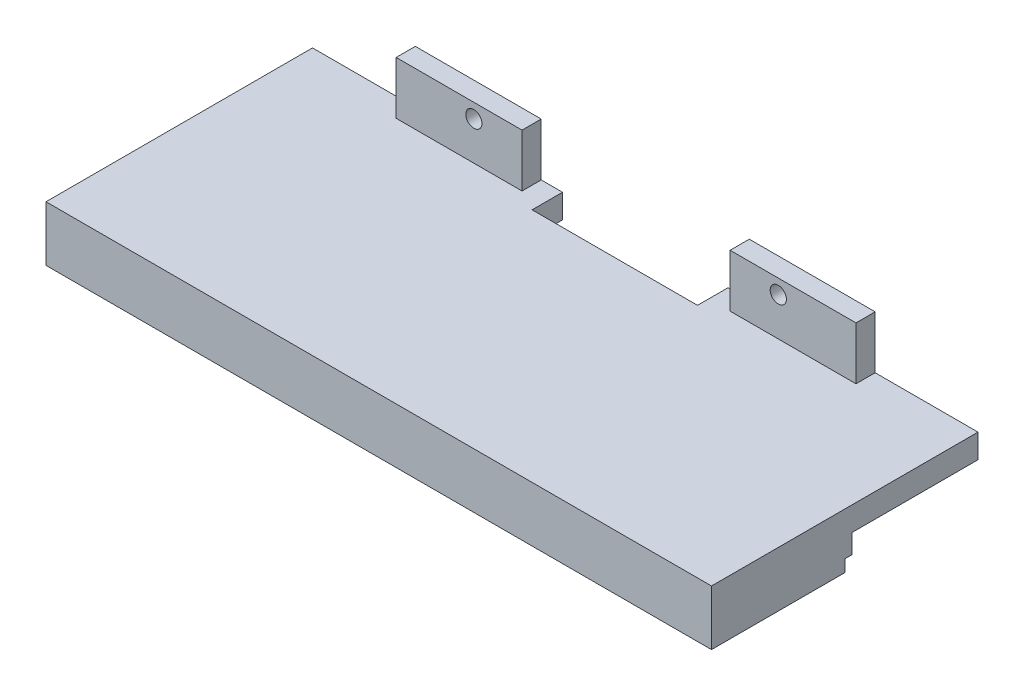
ISO-10303-21;
HEADER;
FILE_DESCRIPTION(('STEP AP214'),'2;1');
FILE_NAME('part.step','',(''),(''),'','','');
FILE_SCHEMA(('AUTOMOTIVE_DESIGN { 1 0 10303 214 1 1 1 1 }'));
ENDSEC;
DATA;
#1=APPLICATION_CONTEXT('core data for automotive mechanical design processes');
#2=APPLICATION_PROTOCOL_DEFINITION('international standard','automotive_design',2000,#1);
#3=PRODUCT_CONTEXT('',#1,'mechanical');
#4=PRODUCT('Part','Part','',(#3));
#5=PRODUCT_RELATED_PRODUCT_CATEGORY('part','',(#4));
#6=PRODUCT_DEFINITION_FORMATION('','',#4);
#7=PRODUCT_DEFINITION_CONTEXT('part definition',#1,'design');
#8=PRODUCT_DEFINITION('design','',#6,#7);
#9=PRODUCT_DEFINITION_SHAPE('','',#8);
#10=(LENGTH_UNIT() NAMED_UNIT(*) SI_UNIT(.MILLI.,.METRE.));
#11=(NAMED_UNIT(*) PLANE_ANGLE_UNIT() SI_UNIT($,.RADIAN.));
#12=(NAMED_UNIT(*) SI_UNIT($,.STERADIAN.) SOLID_ANGLE_UNIT());
#13=UNCERTAINTY_MEASURE_WITH_UNIT(LENGTH_MEASURE(1.E-05),#10,'distance_accuracy_value','');
#14=(GEOMETRIC_REPRESENTATION_CONTEXT(3) GLOBAL_UNCERTAINTY_ASSIGNED_CONTEXT((#13)) GLOBAL_UNIT_ASSIGNED_CONTEXT((#10,
#11,#12)) REPRESENTATION_CONTEXT('',''));
#15=CARTESIAN_POINT('',(0.,0.,0.));
#16=DIRECTION('',(0.,0.,1.));
#17=DIRECTION('',(1.,0.,0.));
#18=AXIS2_PLACEMENT_3D('',#15,#16,#17);
#19=CARTESIAN_POINT('',(0.,0.,55.66875));
#20=DIRECTION('',(0.,1.,0.));
#21=DIRECTION('',(-1.,0.,0.));
#22=AXIS2_PLACEMENT_3D('',#19,#20,#21);
#23=PLANE('',#22);
#24=DIRECTION('',(0.,0.,-1.));
#25=VECTOR('',#24,1.);
#26=CARTESIAN_POINT('',(-234.7,0.,0.));
#27=LINE('',#26,#25);
#28=CARTESIAN_POINT('',(-234.7,0.,-47.5));
#29=VERTEX_POINT('',#28);
#30=CARTESIAN_POINT('',(-234.7,0.,-55.5));
#31=VERTEX_POINT('',#30);
#32=EDGE_CURVE('E222',#29,#31,#27,.T.);
#33=ORIENTED_EDGE('',*,*,#32,.T.);
#34=DIRECTION('',(1.,0.,0.));
#35=VECTOR('',#34,1.);
#36=CARTESIAN_POINT('',(0.,0.,-55.5));
#37=LINE('',#36,#35);
#38=CARTESIAN_POINT('',(-277.6,0.,-55.5));
#39=VERTEX_POINT('',#38);
#40=EDGE_CURVE('E328',#39,#31,#37,.T.);
#41=ORIENTED_EDGE('',*,*,#40,.F.);
#42=DIRECTION('',(0.,0.,-1.));
#43=VECTOR('',#42,1.);
#44=CARTESIAN_POINT('',(-277.6,0.,55.66875));
#45=LINE('',#44,#43);
#46=CARTESIAN_POINT('',(-277.6,0.,55.66875));
#47=VERTEX_POINT('',#46);
#48=EDGE_CURVE('E48',#47,#39,#45,.T.);
#49=ORIENTED_EDGE('',*,*,#48,.F.);
#50=DIRECTION('',(1.,0.,0.));
#51=VECTOR('',#50,1.);
#52=CARTESIAN_POINT('',(0.,0.,55.66875));
#53=LINE('',#52,#51);
#54=CARTESIAN_POINT('',(0.,0.,55.66875));
#55=VERTEX_POINT('',#54);
#56=EDGE_CURVE('E374',#47,#55,#53,.T.);
#57=ORIENTED_EDGE('',*,*,#56,.T.);
#58=DIRECTION('',(0.,0.,-1.));
#59=VECTOR('',#58,1.);
#60=CARTESIAN_POINT('',(0.,0.,55.66875));
#61=LINE('',#60,#59);
#62=CARTESIAN_POINT('',(0.,0.,-55.5));
#63=VERTEX_POINT('',#62);
#64=EDGE_CURVE('E382',#55,#63,#61,.T.);
#65=ORIENTED_EDGE('',*,*,#64,.T.);
#66=DIRECTION('',(1.,0.,0.));
#67=VECTOR('',#66,1.);
#68=CARTESIAN_POINT('',(0.,0.,-55.5));
#69=LINE('',#68,#67);
#70=CARTESIAN_POINT('',(-42.9,0.,-55.5));
#71=VERTEX_POINT('',#70);
#72=EDGE_CURVE('E318',#71,#63,#69,.T.);
#73=ORIENTED_EDGE('',*,*,#72,.F.);
#74=DIRECTION('',(0.,0.,-1.));
#75=VECTOR('',#74,1.);
#76=CARTESIAN_POINT('',(-42.9,0.,0.));
#77=LINE('',#76,#75);
#78=CARTESIAN_POINT('',(-42.9,0.,-47.5));
#79=VERTEX_POINT('',#78);
#80=EDGE_CURVE('E258',#79,#71,#77,.T.);
#81=ORIENTED_EDGE('',*,*,#80,.F.);
#82=DIRECTION('',(1.,0.,0.));
#83=VECTOR('',#82,1.);
#84=CARTESIAN_POINT('',(0.,0.,-47.5));
#85=LINE('',#84,#83);
#86=CARTESIAN_POINT('',(-95.4,0.,-47.5));
#87=VERTEX_POINT('',#86);
#88=EDGE_CURVE('E69',#87,#79,#85,.T.);
#89=ORIENTED_EDGE('',*,*,#88,.F.);
#90=DIRECTION('',(0.,0.,-1.));
#91=VECTOR('',#90,1.);
#92=CARTESIAN_POINT('',(-95.4,0.,0.));
#93=LINE('',#92,#91);
#94=CARTESIAN_POINT('',(-95.4,0.,-55.5));
#95=VERTEX_POINT('',#94);
#96=EDGE_CURVE('E225',#87,#95,#93,.T.);
#97=ORIENTED_EDGE('',*,*,#96,.T.);
#98=CARTESIAN_POINT('',(-104.3,0.,-55.5));
#99=VERTEX_POINT('',#98);
#100=EDGE_CURVE('E322',#99,#95,#69,.T.);
#101=ORIENTED_EDGE('',*,*,#100,.F.);
#102=DIRECTION('',(0.,0.,1.));
#103=VECTOR('',#102,1.);
#104=CARTESIAN_POINT('',(-104.3,0.,0.));
#105=LINE('',#104,#103);
#106=CARTESIAN_POINT('',(-104.3,0.,-42.8));
#107=VERTEX_POINT('',#106);
#108=EDGE_CURVE('E298',#99,#107,#105,.T.);
#109=ORIENTED_EDGE('',*,*,#108,.T.);
#110=DIRECTION('',(-1.,0.,0.));
#111=VECTOR('',#110,1.);
#112=CARTESIAN_POINT('',(2.41031027664994E-13,0.,-42.7999999999994));
#113=LINE('',#112,#111);
#114=CARTESIAN_POINT('',(-173.3,0.,-42.8000000000004));
#115=VERTEX_POINT('',#114);
#116=EDGE_CURVE('E301',#107,#115,#113,.T.);
#117=ORIENTED_EDGE('',*,*,#116,.T.);
#118=DIRECTION('',(0.,0.,-1.));
#119=VECTOR('',#118,1.);
#120=CARTESIAN_POINT('',(-173.3,0.,0.));
#121=LINE('',#120,#119);
#122=CARTESIAN_POINT('',(-173.3,0.,-55.5));
#123=VERTEX_POINT('',#122);
#124=EDGE_CURVE('E284',#115,#123,#121,.T.);
#125=ORIENTED_EDGE('',*,*,#124,.T.);
#126=CARTESIAN_POINT('',(-182.2,0.,-55.5));
#127=VERTEX_POINT('',#126);
#128=EDGE_CURVE('E321',#127,#123,#37,.T.);
#129=ORIENTED_EDGE('',*,*,#128,.F.);
#130=DIRECTION('',(0.,0.,-1.));
#131=VECTOR('',#130,1.);
#132=CARTESIAN_POINT('',(-182.2,0.,0.));
#133=LINE('',#132,#131);
#134=CARTESIAN_POINT('',(-182.2,0.,-47.5));
#135=VERTEX_POINT('',#134);
#136=EDGE_CURVE('E61',#135,#127,#133,.T.);
#137=ORIENTED_EDGE('',*,*,#136,.F.);
#138=DIRECTION('',(1.,0.,0.));
#139=VECTOR('',#138,1.);
#140=CARTESIAN_POINT('',(0.,0.,-47.5));
#141=LINE('',#140,#139);
#142=EDGE_CURVE('E239',#29,#135,#141,.T.);
#143=ORIENTED_EDGE('',*,*,#142,.F.);
#144=EDGE_LOOP('',(#33,#41,#49,#57,#65,#73,#81,#89,#97,#101,#109,#117,#125,#129,#137,#143));
#145=FACE_BOUND('',#144,.T.);
#146=ADVANCED_FACE('F45',(#145),#23,.T.);
#147=CARTESIAN_POINT('',(0.,0.,-3.));
#148=DIRECTION('',(0.,0.,1.));
#149=DIRECTION('',(1.,0.,0.));
#150=AXIS2_PLACEMENT_3D('',#147,#148,#149);
#151=PLANE('',#150);
#152=DIRECTION('',(-1.,0.,0.));
#153=VECTOR('',#152,1.);
#154=CARTESIAN_POINT('',(0.,-10.,-3.));
#155=LINE('',#154,#153);
#156=CARTESIAN_POINT('',(0.,-10.,-3.));
#157=VERTEX_POINT('',#156);
#158=CARTESIAN_POINT('',(-277.6,-10.,-3.));
#159=VERTEX_POINT('',#158);
#160=EDGE_CURVE('E327',#157,#159,#155,.T.);
#161=ORIENTED_EDGE('',*,*,#160,.F.);
#162=DIRECTION('',(0.,1.,0.));
#163=VECTOR('',#162,1.);
#164=CARTESIAN_POINT('',(0.,0.,-3.));
#165=LINE('',#164,#163);
#166=CARTESIAN_POINT('',(0.,-18.,-3.));
#167=VERTEX_POINT('',#166);
#168=EDGE_CURVE('E350',#167,#157,#165,.T.);
#169=ORIENTED_EDGE('',*,*,#168,.F.);
#170=DIRECTION('',(-1.,0.,0.));
#171=VECTOR('',#170,1.);
#172=CARTESIAN_POINT('',(0.,-18.,-3.));
#173=LINE('',#172,#171);
#174=CARTESIAN_POINT('',(-277.6,-18.,-3.));
#175=VERTEX_POINT('',#174);
#176=EDGE_CURVE('E347',#167,#175,#173,.T.);
#177=ORIENTED_EDGE('',*,*,#176,.T.);
#178=DIRECTION('',(0.,1.,0.));
#179=VECTOR('',#178,1.);
#180=CARTESIAN_POINT('',(-277.6,0.,-3.));
#181=LINE('',#180,#179);
#182=EDGE_CURVE('E344',#175,#159,#181,.T.);
#183=ORIENTED_EDGE('',*,*,#182,.T.);
#184=EDGE_LOOP('',(#161,#169,#177,#183));
#185=FACE_BOUND('',#184,.T.);
#186=ADVANCED_FACE('F419',(#185),#151,.F.);
#187=CARTESIAN_POINT('',(0.,0.,0.));
#188=DIRECTION('',(0.,0.,1.));
#189=DIRECTION('',(1.,0.,0.));
#190=AXIS2_PLACEMENT_3D('',#187,#188,#189);
#191=PLANE('',#190);
#192=DIRECTION('',(0.,1.,0.));
#193=VECTOR('',#192,1.);
#194=CARTESIAN_POINT('',(0.,0.,0.));
#195=LINE('',#194,#193);
#196=CARTESIAN_POINT('',(0.,-23.,0.));
#197=VERTEX_POINT('',#196);
#198=CARTESIAN_POINT('',(0.,-18.,0.));
#199=VERTEX_POINT('',#198);
#200=EDGE_CURVE('E384',#197,#199,#195,.T.);
#201=ORIENTED_EDGE('',*,*,#200,.F.);
#202=DIRECTION('',(-1.,0.,0.));
#203=VECTOR('',#202,1.);
#204=CARTESIAN_POINT('',(0.,-23.,0.));
#205=LINE('',#204,#203);
#206=CARTESIAN_POINT('',(-5.00000000000001,-23.,0.));
#207=VERTEX_POINT('',#206);
#208=EDGE_CURVE('E336',#197,#207,#205,.T.);
#209=ORIENTED_EDGE('',*,*,#208,.T.);
#210=DIRECTION('',(0.,1.,0.));
#211=VECTOR('',#210,1.);
#212=CARTESIAN_POINT('',(-5.00000000000001,0.,0.));
#213=LINE('',#212,#211);
#214=CARTESIAN_POINT('',(-5.00000000000001,-18.,0.));
#215=VERTEX_POINT('',#214);
#216=EDGE_CURVE('E378',#207,#215,#213,.T.);
#217=ORIENTED_EDGE('',*,*,#216,.T.);
#218=DIRECTION('',(-1.,0.,0.));
#219=VECTOR('',#218,1.);
#220=CARTESIAN_POINT('',(0.,-18.,0.));
#221=LINE('',#220,#219);
#222=EDGE_CURVE('E348',#199,#215,#221,.T.);
#223=ORIENTED_EDGE('',*,*,#222,.F.);
#224=EDGE_LOOP('',(#201,#209,#217,#223));
#225=FACE_BOUND('',#224,.T.);
#226=ADVANCED_FACE('F492',(#225),#191,.F.);
#227=DIRECTION('',(0.,-1.,0.));
#228=VECTOR('',#227,1.);
#229=CARTESIAN_POINT('',(-272.6,0.,0.));
#230=LINE('',#229,#228);
#231=CARTESIAN_POINT('',(-272.6,-18.,0.));
#232=VERTEX_POINT('',#231);
#233=CARTESIAN_POINT('',(-272.6,-23.,0.));
#234=VERTEX_POINT('',#233);
#235=EDGE_CURVE('E386',#232,#234,#230,.T.);
#236=ORIENTED_EDGE('',*,*,#235,.T.);
#237=CARTESIAN_POINT('',(-277.6,-23.,0.));
#238=VERTEX_POINT('',#237);
#239=EDGE_CURVE('E340',#234,#238,#205,.T.);
#240=ORIENTED_EDGE('',*,*,#239,.T.);
#241=DIRECTION('',(0.,1.,0.));
#242=VECTOR('',#241,1.);
#243=CARTESIAN_POINT('',(-277.6,0.,0.));
#244=LINE('',#243,#242);
#245=CARTESIAN_POINT('',(-277.6,-18.,0.));
#246=VERTEX_POINT('',#245);
#247=EDGE_CURVE('E373',#238,#246,#244,.T.);
#248=ORIENTED_EDGE('',*,*,#247,.T.);
#249=EDGE_CURVE('E343',#232,#246,#221,.T.);
#250=ORIENTED_EDGE('',*,*,#249,.F.);
#251=EDGE_LOOP('',(#236,#240,#248,#250));
#252=FACE_BOUND('',#251,.T.);
#253=ADVANCED_FACE('F432',(#252),#191,.F.);
#254=CARTESIAN_POINT('',(-272.6,0.,55.66875));
#255=DIRECTION('',(1.,0.,0.));
#256=DIRECTION('',(0.,0.,-1.));
#257=AXIS2_PLACEMENT_3D('',#254,#255,#256);
#258=PLANE('',#257);
#259=DIRECTION('',(0.,1.,0.));
#260=VECTOR('',#259,1.);
#261=CARTESIAN_POINT('',(-272.6,0.,50.66875));
#262=LINE('',#261,#260);
#263=CARTESIAN_POINT('',(-272.6,-23.,50.66875));
#264=VERTEX_POINT('',#263);
#265=CARTESIAN_POINT('',(-272.6,-5.,50.66875));
#266=VERTEX_POINT('',#265);
#267=EDGE_CURVE('E369',#264,#266,#262,.T.);
#268=ORIENTED_EDGE('',*,*,#267,.F.);
#269=DIRECTION('',(0.,0.,-1.));
#270=VECTOR('',#269,1.);
#271=CARTESIAN_POINT('',(-272.6,-23.,55.66875));
#272=LINE('',#271,#270);
#273=EDGE_CURVE('E393',#264,#234,#272,.T.);
#274=ORIENTED_EDGE('',*,*,#273,.T.);
#275=ORIENTED_EDGE('',*,*,#235,.F.);
#276=CARTESIAN_POINT('',(-272.6,-5.,0.));
#277=VERTEX_POINT('',#276);
#278=EDGE_CURVE('E387',#277,#232,#230,.T.);
#279=ORIENTED_EDGE('',*,*,#278,.F.);
#280=DIRECTION('',(0.,0.,-1.));
#281=VECTOR('',#280,1.);
#282=CARTESIAN_POINT('',(-272.6,-5.,55.66875));
#283=LINE('',#282,#281);
#284=EDGE_CURVE('E11',#266,#277,#283,.T.);
#285=ORIENTED_EDGE('',*,*,#284,.F.);
#286=EDGE_LOOP('',(#268,#274,#275,#279,#285));
#287=FACE_BOUND('',#286,.T.);
#288=ADVANCED_FACE('F521',(#287),#258,.T.);
#289=CARTESIAN_POINT('',(0.,-4.99999999999997,55.66875));
#290=DIRECTION('',(0.,-1.,0.));
#291=DIRECTION('',(1.,0.,0.));
#292=AXIS2_PLACEMENT_3D('',#289,#290,#291);
#293=PLANE('',#292);
#294=DIRECTION('',(1.,0.,0.));
#295=VECTOR('',#294,1.);
#296=CARTESIAN_POINT('',(0.,-4.99999999999997,50.66875));
#297=LINE('',#296,#295);
#298=CARTESIAN_POINT('',(-5.,-4.99999999999997,50.66875));
#299=VERTEX_POINT('',#298);
#300=EDGE_CURVE('E367',#266,#299,#297,.T.);
#301=ORIENTED_EDGE('',*,*,#300,.F.);
#302=ORIENTED_EDGE('',*,*,#284,.T.);
#303=DIRECTION('',(-1.,0.,0.));
#304=VECTOR('',#303,1.);
#305=CARTESIAN_POINT('',(0.,-4.99999999999997,0.));
#306=LINE('',#305,#304);
#307=CARTESIAN_POINT('',(-5.00000000000001,-4.99999999999997,0.));
#308=VERTEX_POINT('',#307);
#309=EDGE_CURVE('E389',#308,#277,#306,.T.);
#310=ORIENTED_EDGE('',*,*,#309,.F.);
#311=DIRECTION('',(0.,0.,-1.));
#312=VECTOR('',#311,1.);
#313=CARTESIAN_POINT('',(-5.00000000000001,-4.99999999999997,55.66875));
#314=LINE('',#313,#312);
#315=EDGE_CURVE('E53',#299,#308,#314,.T.);
#316=ORIENTED_EDGE('',*,*,#315,.F.);
#317=EDGE_LOOP('',(#301,#302,#310,#316));
#318=FACE_BOUND('',#317,.T.);
#319=ADVANCED_FACE('F517',(#318),#293,.T.);
#320=CARTESIAN_POINT('',(-5.00000000000001,0.,55.66875));
#321=DIRECTION('',(-1.,0.,0.));
#322=DIRECTION('',(0.,-1.,0.));
#323=AXIS2_PLACEMENT_3D('',#320,#321,#322);
#324=PLANE('',#323);
#325=DIRECTION('',(0.,-1.,0.));
#326=VECTOR('',#325,1.);
#327=CARTESIAN_POINT('',(-5.00000000000001,0.,50.66875));
#328=LINE('',#327,#326);
#329=CARTESIAN_POINT('',(-5.,-23.,50.66875));
#330=VERTEX_POINT('',#329);
#331=EDGE_CURVE('E364',#299,#330,#328,.T.);
#332=ORIENTED_EDGE('',*,*,#331,.F.);
#333=ORIENTED_EDGE('',*,*,#315,.T.);
#334=DIRECTION('',(0.,1.,0.));
#335=VECTOR('',#334,1.);
#336=CARTESIAN_POINT('',(-5.00000000000001,0.,0.));
#337=LINE('',#336,#335);
#338=EDGE_CURVE('E360',#215,#308,#337,.T.);
#339=ORIENTED_EDGE('',*,*,#338,.F.);
#340=ORIENTED_EDGE('',*,*,#216,.F.);
#341=DIRECTION('',(0.,0.,-1.));
#342=VECTOR('',#341,1.);
#343=CARTESIAN_POINT('',(-5.00000000000001,-23.,55.66875));
#344=LINE('',#343,#342);
#345=EDGE_CURVE('E396',#330,#207,#344,.T.);
#346=ORIENTED_EDGE('',*,*,#345,.F.);
#347=EDGE_LOOP('',(#332,#333,#339,#340,#346));
#348=FACE_BOUND('',#347,.T.);
#349=ADVANCED_FACE('F514',(#348),#324,.T.);
#350=CARTESIAN_POINT('',(-277.6,0.,55.66875));
#351=DIRECTION('',(-1.,0.,0.));
#352=DIRECTION('',(0.,0.,1.));
#353=AXIS2_PLACEMENT_3D('',#350,#351,#352);
#354=PLANE('',#353);
#355=DIRECTION('',(0.,0.,-1.));
#356=VECTOR('',#355,1.);
#357=CARTESIAN_POINT('',(-277.6,-23.,55.66875));
#358=LINE('',#357,#356);
#359=CARTESIAN_POINT('',(-277.6,-23.,55.66875));
#360=VERTEX_POINT('',#359);
#361=EDGE_CURVE('E339',#360,#238,#358,.T.);
#362=ORIENTED_EDGE('',*,*,#361,.F.);
#363=DIRECTION('',(0.,1.,0.));
#364=VECTOR('',#363,1.);
#365=CARTESIAN_POINT('',(-277.6,0.,55.66875));
#366=LINE('',#365,#364);
#367=EDGE_CURVE('E377',#360,#47,#366,.T.);
#368=ORIENTED_EDGE('',*,*,#367,.T.);
#369=ORIENTED_EDGE('',*,*,#48,.T.);
#370=DIRECTION('',(0.,1.,0.));
#371=VECTOR('',#370,1.);
#372=CARTESIAN_POINT('',(-277.6,-111.442052424032,-55.5));
#373=LINE('',#372,#371);
#374=CARTESIAN_POINT('',(-277.6,-9.99999999999999,-55.5));
#375=VERTEX_POINT('',#374);
#376=EDGE_CURVE('E295',#375,#39,#373,.T.);
#377=ORIENTED_EDGE('',*,*,#376,.F.);
#378=DIRECTION('',(0.,0.,1.));
#379=VECTOR('',#378,1.);
#380=CARTESIAN_POINT('',(-277.6,-9.99999999999999,0.));
#381=LINE('',#380,#379);
#382=EDGE_CURVE('E315',#375,#159,#381,.T.);
#383=ORIENTED_EDGE('',*,*,#382,.T.);
#384=ORIENTED_EDGE('',*,*,#182,.F.);
#385=DIRECTION('',(0.,0.,1.));
#386=VECTOR('',#385,1.);
#387=CARTESIAN_POINT('',(-277.6,-18.,-3.));
#388=LINE('',#387,#386);
#389=EDGE_CURVE('E353',#175,#246,#388,.T.);
#390=ORIENTED_EDGE('',*,*,#389,.T.);
#391=ORIENTED_EDGE('',*,*,#247,.F.);
#392=EDGE_LOOP('',(#362,#368,#369,#377,#383,#384,#390,#391));
#393=FACE_BOUND('',#392,.T.);
#394=ADVANCED_FACE('F406',(#393),#354,.T.);
#395=CARTESIAN_POINT('',(0.,0.,55.66875));
#396=DIRECTION('',(-1.,0.,0.));
#397=DIRECTION('',(0.,0.,1.));
#398=AXIS2_PLACEMENT_3D('',#395,#396,#397);
#399=PLANE('',#398);
#400=DIRECTION('',(0.,1.,0.));
#401=VECTOR('',#400,1.);
#402=CARTESIAN_POINT('',(0.,0.,55.66875));
#403=LINE('',#402,#401);
#404=CARTESIAN_POINT('',(0.,-23.,55.66875));
#405=VERTEX_POINT('',#404);
#406=EDGE_CURVE('E380',#405,#55,#403,.T.);
#407=ORIENTED_EDGE('',*,*,#406,.F.);
#408=DIRECTION('',(0.,0.,-1.));
#409=VECTOR('',#408,1.);
#410=CARTESIAN_POINT('',(0.,-23.,0.));
#411=LINE('',#410,#409);
#412=EDGE_CURVE('E330',#405,#197,#411,.T.);
#413=ORIENTED_EDGE('',*,*,#412,.T.);
#414=ORIENTED_EDGE('',*,*,#200,.T.);
#415=DIRECTION('',(0.,0.,1.));
#416=VECTOR('',#415,1.);
#417=CARTESIAN_POINT('',(0.,-18.,-3.));
#418=LINE('',#417,#416);
#419=EDGE_CURVE('E357',#167,#199,#418,.T.);
#420=ORIENTED_EDGE('',*,*,#419,.F.);
#421=ORIENTED_EDGE('',*,*,#168,.T.);
#422=DIRECTION('',(0.,0.,-1.));
#423=VECTOR('',#422,1.);
#424=CARTESIAN_POINT('',(0.,-9.99999999999999,0.));
#425=LINE('',#424,#423);
#426=CARTESIAN_POINT('',(0.,-9.99999999999999,-55.5));
#427=VERTEX_POINT('',#426);
#428=EDGE_CURVE('E281',#157,#427,#425,.T.);
#429=ORIENTED_EDGE('',*,*,#428,.T.);
#430=DIRECTION('',(0.,1.,0.));
#431=VECTOR('',#430,1.);
#432=CARTESIAN_POINT('',(0.,-111.442052424032,-55.5));
#433=LINE('',#432,#431);
#434=EDGE_CURVE('E280',#427,#63,#433,.T.);
#435=ORIENTED_EDGE('',*,*,#434,.T.);
#436=ORIENTED_EDGE('',*,*,#64,.F.);
#437=EDGE_LOOP('',(#407,#413,#414,#420,#421,#429,#435,#436));
#438=FACE_BOUND('',#437,.T.);
#439=ADVANCED_FACE('F442',(#438),#399,.F.);
#440=CARTESIAN_POINT('',(0.,0.,55.66875));
#441=DIRECTION('',(0.,0.,1.));
#442=DIRECTION('',(1.,0.,0.));
#443=AXIS2_PLACEMENT_3D('',#440,#441,#442);
#444=PLANE('',#443);
#445=DIRECTION('',(-1.,0.,0.));
#446=VECTOR('',#445,1.);
#447=CARTESIAN_POINT('',(0.,-23.,55.66875));
#448=LINE('',#447,#446);
#449=EDGE_CURVE('E335',#405,#360,#448,.T.);
#450=ORIENTED_EDGE('',*,*,#449,.F.);
#451=ORIENTED_EDGE('',*,*,#406,.T.);
#452=ORIENTED_EDGE('',*,*,#56,.F.);
#453=ORIENTED_EDGE('',*,*,#367,.F.);
#454=EDGE_LOOP('',(#450,#451,#452,#453));
#455=FACE_BOUND('',#454,.T.);
#456=ADVANCED_FACE('F440',(#455),#444,.T.);
#457=CARTESIAN_POINT('',(0.,0.,50.66875));
#458=DIRECTION('',(0.,0.,-1.));
#459=DIRECTION('',(-1.,0.,0.));
#460=AXIS2_PLACEMENT_3D('',#457,#458,#459);
#461=PLANE('',#460);
#462=DIRECTION('',(1.,0.,0.));
#463=VECTOR('',#462,1.);
#464=CARTESIAN_POINT('',(0.,-23.,50.66875));
#465=LINE('',#464,#463);
#466=EDGE_CURVE('E371',#264,#330,#465,.T.);
#467=ORIENTED_EDGE('',*,*,#466,.F.);
#468=ORIENTED_EDGE('',*,*,#267,.T.);
#469=ORIENTED_EDGE('',*,*,#300,.T.);
#470=ORIENTED_EDGE('',*,*,#331,.T.);
#471=EDGE_LOOP('',(#467,#468,#469,#470));
#472=FACE_BOUND('',#471,.T.);
#473=ADVANCED_FACE('F508',(#472),#461,.T.);
#474=CARTESIAN_POINT('',(0.,-18.,-3.));
#475=DIRECTION('',(0.,1.,0.));
#476=DIRECTION('',(-1.,0.,0.));
#477=AXIS2_PLACEMENT_3D('',#474,#475,#476);
#478=PLANE('',#477);
#479=ORIENTED_EDGE('',*,*,#222,.T.);
#480=EDGE_CURVE('E356',#215,#232,#221,.T.);
#481=ORIENTED_EDGE('',*,*,#480,.T.);
#482=ORIENTED_EDGE('',*,*,#249,.T.);
#483=ORIENTED_EDGE('',*,*,#389,.F.);
#484=ORIENTED_EDGE('',*,*,#176,.F.);
#485=ORIENTED_EDGE('',*,*,#419,.T.);
#486=EDGE_LOOP('',(#479,#481,#482,#483,#484,#485));
#487=FACE_BOUND('',#486,.T.);
#488=ADVANCED_FACE('F425',(#487),#478,.F.);
#489=CARTESIAN_POINT('',(0.,0.,0.));
#490=DIRECTION('',(0.,0.,1.));
#491=DIRECTION('',(1.,0.,0.));
#492=AXIS2_PLACEMENT_3D('',#489,#490,#491);
#493=PLANE('',#492);
#494=ORIENTED_EDGE('',*,*,#309,.T.);
#495=ORIENTED_EDGE('',*,*,#278,.T.);
#496=ORIENTED_EDGE('',*,*,#480,.F.);
#497=ORIENTED_EDGE('',*,*,#338,.T.);
#498=EDGE_LOOP('',(#494,#495,#496,#497));
#499=FACE_BOUND('',#498,.T.);
#500=ADVANCED_FACE('F502',(#499),#493,.T.);
#501=CARTESIAN_POINT('',(0.,-23.,0.));
#502=DIRECTION('',(0.,1.,0.));
#503=DIRECTION('',(0.,0.,1.));
#504=AXIS2_PLACEMENT_3D('',#501,#502,#503);
#505=PLANE('',#504);
#506=ORIENTED_EDGE('',*,*,#361,.T.);
#507=ORIENTED_EDGE('',*,*,#239,.F.);
#508=ORIENTED_EDGE('',*,*,#273,.F.);
#509=ORIENTED_EDGE('',*,*,#466,.T.);
#510=ORIENTED_EDGE('',*,*,#345,.T.);
#511=ORIENTED_EDGE('',*,*,#208,.F.);
#512=ORIENTED_EDGE('',*,*,#412,.F.);
#513=ORIENTED_EDGE('',*,*,#449,.T.);
#514=EDGE_LOOP('',(#506,#507,#508,#509,#510,#511,#512,#513));
#515=FACE_BOUND('',#514,.T.);
#516=ADVANCED_FACE('F435',(#515),#505,.F.);
#517=CARTESIAN_POINT('',(0.,-10.,-55.5));
#518=DIRECTION('',(0.,0.,1.));
#519=DIRECTION('',(1.,0.,0.));
#520=AXIS2_PLACEMENT_3D('',#517,#518,#519);
#521=PLANE('',#520);
#522=CARTESIAN_POINT('',(-202.3,16.,-55.5));
#523=DIRECTION('',(0.,0.,1.));
#524=DIRECTION('',(1.,0.,0.));
#525=AXIS2_PLACEMENT_3D('',#522,#523,#524);
#526=CIRCLE('',#525,3.3782);
#527=CARTESIAN_POINT('',(-198.9218,16.,-55.5));
#528=VERTEX_POINT('',#527);
#529=EDGE_CURVE('E242',#528,#528,#526,.T.);
#530=ORIENTED_EDGE('',*,*,#529,.T.);
#531=EDGE_LOOP('',(#530));
#532=FACE_BOUND('',#531,.T.);
#533=ORIENTED_EDGE('',*,*,#40,.T.);
#534=DIRECTION('',(0.,-1.,0.));
#535=VECTOR('',#534,1.);
#536=CARTESIAN_POINT('',(-234.7,22.,-55.5));
#537=LINE('',#536,#535);
#538=CARTESIAN_POINT('',(-234.7,22.,-55.5));
#539=VERTEX_POINT('',#538);
#540=EDGE_CURVE('E247',#539,#31,#537,.T.);
#541=ORIENTED_EDGE('',*,*,#540,.F.);
#542=DIRECTION('',(1.,0.,0.));
#543=VECTOR('',#542,1.);
#544=CARTESIAN_POINT('',(0.,22.,-55.5));
#545=LINE('',#544,#543);
#546=CARTESIAN_POINT('',(-182.2,22.,-55.5));
#547=VERTEX_POINT('',#546);
#548=EDGE_CURVE('E237',#539,#547,#545,.T.);
#549=ORIENTED_EDGE('',*,*,#548,.T.);
#550=DIRECTION('',(0.,-1.,0.));
#551=VECTOR('',#550,1.);
#552=CARTESIAN_POINT('',(-182.2,22.,-55.5));
#553=LINE('',#552,#551);
#554=EDGE_CURVE('E251',#547,#127,#553,.T.);
#555=ORIENTED_EDGE('',*,*,#554,.T.);
#556=ORIENTED_EDGE('',*,*,#128,.T.);
#557=DIRECTION('',(0.,1.,0.));
#558=VECTOR('',#557,1.);
#559=CARTESIAN_POINT('',(-173.3,-111.442052424032,-55.5));
#560=LINE('',#559,#558);
#561=CARTESIAN_POINT('',(-173.3,-9.99999999999999,-55.5));
#562=VERTEX_POINT('',#561);
#563=EDGE_CURVE('E304',#562,#123,#560,.T.);
#564=ORIENTED_EDGE('',*,*,#563,.F.);
#565=DIRECTION('',(1.,0.,0.));
#566=VECTOR('',#565,1.);
#567=CARTESIAN_POINT('',(0.,-10.,-55.5));
#568=LINE('',#567,#566);
#569=EDGE_CURVE('E325',#375,#562,#568,.T.);
#570=ORIENTED_EDGE('',*,*,#569,.F.);
#571=ORIENTED_EDGE('',*,*,#376,.T.);
#572=EDGE_LOOP('',(#533,#541,#549,#555,#556,#564,#570,#571));
#573=FACE_BOUND('',#572,.T.);
#574=ADVANCED_FACE('F410',(#532,#573),#521,.F.);
#575=CARTESIAN_POINT('',(0.,-10.,0.));
#576=DIRECTION('',(0.,1.,0.));
#577=DIRECTION('',(-1.,0.,0.));
#578=AXIS2_PLACEMENT_3D('',#575,#576,#577);
#579=PLANE('',#578);
#580=ORIENTED_EDGE('',*,*,#569,.T.);
#581=DIRECTION('',(0.,0.,1.));
#582=VECTOR('',#581,1.);
#583=CARTESIAN_POINT('',(-173.3,-9.99999999999999,0.));
#584=LINE('',#583,#582);
#585=CARTESIAN_POINT('',(-173.3,-9.99999999999999,-42.8000000000004));
#586=VERTEX_POINT('',#585);
#587=EDGE_CURVE('E293',#562,#586,#584,.T.);
#588=ORIENTED_EDGE('',*,*,#587,.T.);
#589=DIRECTION('',(1.,0.,0.));
#590=VECTOR('',#589,1.);
#591=CARTESIAN_POINT('',(2.41039377268346E-13,-9.99999999999999,-42.7999999999994));
#592=LINE('',#591,#590);
#593=CARTESIAN_POINT('',(-104.3,-9.99999999999999,-42.8));
#594=VERTEX_POINT('',#593);
#595=EDGE_CURVE('E290',#586,#594,#592,.T.);
#596=ORIENTED_EDGE('',*,*,#595,.T.);
#597=DIRECTION('',(0.,0.,-1.));
#598=VECTOR('',#597,1.);
#599=CARTESIAN_POINT('',(-104.3,-9.99999999999999,0.));
#600=LINE('',#599,#598);
#601=CARTESIAN_POINT('',(-104.3,-9.99999999999999,-55.5));
#602=VERTEX_POINT('',#601);
#603=EDGE_CURVE('E287',#594,#602,#600,.T.);
#604=ORIENTED_EDGE('',*,*,#603,.T.);
#605=DIRECTION('',(1.,0.,0.));
#606=VECTOR('',#605,1.);
#607=CARTESIAN_POINT('',(0.,-10.,-55.5));
#608=LINE('',#607,#606);
#609=EDGE_CURVE('E319',#602,#427,#608,.T.);
#610=ORIENTED_EDGE('',*,*,#609,.T.);
#611=ORIENTED_EDGE('',*,*,#428,.F.);
#612=ORIENTED_EDGE('',*,*,#160,.T.);
#613=ORIENTED_EDGE('',*,*,#382,.F.);
#614=EDGE_LOOP('',(#580,#588,#596,#604,#610,#611,#612,#613));
#615=FACE_BOUND('',#614,.T.);
#616=ADVANCED_FACE('F415',(#615),#579,.F.);
#617=CARTESIAN_POINT('',(0.,-10.,-55.5));
#618=DIRECTION('',(0.,0.,1.));
#619=DIRECTION('',(1.,0.,0.));
#620=AXIS2_PLACEMENT_3D('',#617,#618,#619);
#621=PLANE('',#620);
#622=CARTESIAN_POINT('',(-75.3,16.0000000000001,-55.5));
#623=DIRECTION('',(0.,0.,1.));
#624=DIRECTION('',(1.,0.,0.));
#625=AXIS2_PLACEMENT_3D('',#622,#623,#624);
#626=CIRCLE('',#625,3.3782);
#627=CARTESIAN_POINT('',(-71.9218,16.0000000000001,-55.5));
#628=VERTEX_POINT('',#627);
#629=EDGE_CURVE('E1074',#628,#628,#626,.T.);
#630=ORIENTED_EDGE('',*,*,#629,.T.);
#631=EDGE_LOOP('',(#630));
#632=FACE_BOUND('',#631,.T.);
#633=ORIENTED_EDGE('',*,*,#100,.T.);
#634=DIRECTION('',(0.,-1.,0.));
#635=VECTOR('',#634,1.);
#636=CARTESIAN_POINT('',(-95.4,22.,-55.5));
#637=LINE('',#636,#635);
#638=CARTESIAN_POINT('',(-95.4,22.,-55.5));
#639=VERTEX_POINT('',#638);
#640=EDGE_CURVE('E265',#639,#95,#637,.T.);
#641=ORIENTED_EDGE('',*,*,#640,.F.);
#642=DIRECTION('',(1.,0.,0.));
#643=VECTOR('',#642,1.);
#644=CARTESIAN_POINT('',(0.,22.,-55.5));
#645=LINE('',#644,#643);
#646=CARTESIAN_POINT('',(-42.9,22.,-55.5));
#647=VERTEX_POINT('',#646);
#648=EDGE_CURVE('E262',#639,#647,#645,.T.);
#649=ORIENTED_EDGE('',*,*,#648,.T.);
#650=DIRECTION('',(0.,-1.,0.));
#651=VECTOR('',#650,1.);
#652=CARTESIAN_POINT('',(-42.9,22.,-55.5));
#653=LINE('',#652,#651);
#654=EDGE_CURVE('E272',#647,#71,#653,.T.);
#655=ORIENTED_EDGE('',*,*,#654,.T.);
#656=ORIENTED_EDGE('',*,*,#72,.T.);
#657=ORIENTED_EDGE('',*,*,#434,.F.);
#658=ORIENTED_EDGE('',*,*,#609,.F.);
#659=DIRECTION('',(0.,1.,0.));
#660=VECTOR('',#659,1.);
#661=CARTESIAN_POINT('',(-104.3,-111.442052424032,-55.5));
#662=LINE('',#661,#660);
#663=EDGE_CURVE('E308',#602,#99,#662,.T.);
#664=ORIENTED_EDGE('',*,*,#663,.T.);
#665=EDGE_LOOP('',(#633,#641,#649,#655,#656,#657,#658,#664));
#666=FACE_BOUND('',#665,.T.);
#667=ADVANCED_FACE('F446',(#632,#666),#621,.F.);
#668=CARTESIAN_POINT('',(-173.3,-111.442052424032,0.));
#669=DIRECTION('',(1.,0.,0.));
#670=DIRECTION('',(0.,1.,0.));
#671=AXIS2_PLACEMENT_3D('',#668,#669,#670);
#672=PLANE('',#671);
#673=ORIENTED_EDGE('',*,*,#587,.F.);
#674=ORIENTED_EDGE('',*,*,#563,.T.);
#675=ORIENTED_EDGE('',*,*,#124,.F.);
#676=DIRECTION('',(0.,1.,0.));
#677=VECTOR('',#676,1.);
#678=CARTESIAN_POINT('',(-173.3,-111.442052424032,-42.8000000000004));
#679=LINE('',#678,#677);
#680=EDGE_CURVE('E291',#586,#115,#679,.T.);
#681=ORIENTED_EDGE('',*,*,#680,.F.);
#682=EDGE_LOOP('',(#673,#674,#675,#681));
#683=FACE_BOUND('',#682,.T.);
#684=ADVANCED_FACE('F475',(#683),#672,.T.);
#685=CARTESIAN_POINT('',(2.41124077358441E-13,-111.442052424032,-42.7999999999994));
#686=DIRECTION('',(0.,0.,-1.));
#687=DIRECTION('',(-1.,0.,0.));
#688=AXIS2_PLACEMENT_3D('',#685,#686,#687);
#689=PLANE('',#688);
#690=ORIENTED_EDGE('',*,*,#595,.F.);
#691=ORIENTED_EDGE('',*,*,#680,.T.);
#692=ORIENTED_EDGE('',*,*,#116,.F.);
#693=DIRECTION('',(0.,1.,0.));
#694=VECTOR('',#693,1.);
#695=CARTESIAN_POINT('',(-104.3,-111.442052424032,-42.8));
#696=LINE('',#695,#694);
#697=EDGE_CURVE('E306',#594,#107,#696,.T.);
#698=ORIENTED_EDGE('',*,*,#697,.F.);
#699=EDGE_LOOP('',(#690,#691,#692,#698));
#700=FACE_BOUND('',#699,.T.);
#701=ADVANCED_FACE('F471',(#700),#689,.T.);
#702=CARTESIAN_POINT('',(-104.3,-111.442052424032,0.));
#703=DIRECTION('',(-1.,0.,0.));
#704=DIRECTION('',(0.,-1.,0.));
#705=AXIS2_PLACEMENT_3D('',#702,#703,#704);
#706=PLANE('',#705);
#707=ORIENTED_EDGE('',*,*,#603,.F.);
#708=ORIENTED_EDGE('',*,*,#697,.T.);
#709=ORIENTED_EDGE('',*,*,#108,.F.);
#710=ORIENTED_EDGE('',*,*,#663,.F.);
#711=EDGE_LOOP('',(#707,#708,#709,#710));
#712=FACE_BOUND('',#711,.T.);
#713=ADVANCED_FACE('F466',(#712),#706,.T.);
#714=CARTESIAN_POINT('',(-95.4,22.,0.));
#715=DIRECTION('',(-1.,0.,0.));
#716=DIRECTION('',(0.,-1.,0.));
#717=AXIS2_PLACEMENT_3D('',#714,#715,#716);
#718=PLANE('',#717);
#719=ORIENTED_EDGE('',*,*,#96,.F.);
#720=DIRECTION('',(0.,-1.,0.));
#721=VECTOR('',#720,1.);
#722=CARTESIAN_POINT('',(-95.4,22.,-47.5));
#723=LINE('',#722,#721);
#724=CARTESIAN_POINT('',(-95.4,22.,-47.5));
#725=VERTEX_POINT('',#724);
#726=EDGE_CURVE('E278',#725,#87,#723,.T.);
#727=ORIENTED_EDGE('',*,*,#726,.F.);
#728=DIRECTION('',(0.,0.,-1.));
#729=VECTOR('',#728,1.);
#730=CARTESIAN_POINT('',(-95.4,22.,0.));
#731=LINE('',#730,#729);
#732=EDGE_CURVE('E254',#725,#639,#731,.T.);
#733=ORIENTED_EDGE('',*,*,#732,.T.);
#734=ORIENTED_EDGE('',*,*,#640,.T.);
#735=EDGE_LOOP('',(#719,#727,#733,#734));
#736=FACE_BOUND('',#735,.T.);
#737=ADVANCED_FACE('F461',(#736),#718,.T.);
#738=CARTESIAN_POINT('',(0.,22.,-47.5));
#739=DIRECTION('',(0.,0.,-1.));
#740=DIRECTION('',(-1.,0.,0.));
#741=AXIS2_PLACEMENT_3D('',#738,#739,#740);
#742=PLANE('',#741);
#743=CARTESIAN_POINT('',(-75.3,16.0000000000001,-47.5));
#744=DIRECTION('',(0.,0.,1.));
#745=DIRECTION('',(1.,0.,0.));
#746=AXIS2_PLACEMENT_3D('',#743,#744,#745);
#747=CIRCLE('',#746,3.3782);
#748=CARTESIAN_POINT('',(-71.9218,16.0000000000001,-47.5));
#749=VERTEX_POINT('',#748);
#750=EDGE_CURVE('E1077',#749,#749,#747,.T.);
#751=ORIENTED_EDGE('',*,*,#750,.F.);
#752=EDGE_LOOP('',(#751));
#753=FACE_BOUND('',#752,.T.);
#754=ORIENTED_EDGE('',*,*,#88,.T.);
#755=DIRECTION('',(0.,-1.,0.));
#756=VECTOR('',#755,1.);
#757=CARTESIAN_POINT('',(-42.9,22.,-47.5));
#758=LINE('',#757,#756);
#759=CARTESIAN_POINT('',(-42.9,22.,-47.5));
#760=VERTEX_POINT('',#759);
#761=EDGE_CURVE('E275',#760,#79,#758,.T.);
#762=ORIENTED_EDGE('',*,*,#761,.F.);
#763=DIRECTION('',(1.,0.,0.));
#764=VECTOR('',#763,1.);
#765=CARTESIAN_POINT('',(0.,22.,-47.5));
#766=LINE('',#765,#764);
#767=EDGE_CURVE('E257',#725,#760,#766,.T.);
#768=ORIENTED_EDGE('',*,*,#767,.F.);
#769=ORIENTED_EDGE('',*,*,#726,.T.);
#770=EDGE_LOOP('',(#754,#762,#768,#769));
#771=FACE_BOUND('',#770,.T.);
#772=ADVANCED_FACE('F451',(#753,#771),#742,.F.);
#773=CARTESIAN_POINT('',(-42.9,22.,0.));
#774=DIRECTION('',(-1.,0.,0.));
#775=DIRECTION('',(0.,0.,1.));
#776=AXIS2_PLACEMENT_3D('',#773,#774,#775);
#777=PLANE('',#776);
#778=ORIENTED_EDGE('',*,*,#80,.T.);
#779=ORIENTED_EDGE('',*,*,#654,.F.);
#780=DIRECTION('',(0.,0.,-1.));
#781=VECTOR('',#780,1.);
#782=CARTESIAN_POINT('',(-42.9,22.,0.));
#783=LINE('',#782,#781);
#784=EDGE_CURVE('E260',#760,#647,#783,.T.);
#785=ORIENTED_EDGE('',*,*,#784,.F.);
#786=ORIENTED_EDGE('',*,*,#761,.T.);
#787=EDGE_LOOP('',(#778,#779,#785,#786));
#788=FACE_BOUND('',#787,.T.);
#789=ADVANCED_FACE('F455',(#788),#777,.F.);
#790=CARTESIAN_POINT('',(0.,22.,0.));
#791=DIRECTION('',(0.,1.,0.));
#792=DIRECTION('',(-1.,0.,0.));
#793=AXIS2_PLACEMENT_3D('',#790,#791,#792);
#794=PLANE('',#793);
#795=ORIENTED_EDGE('',*,*,#732,.F.);
#796=ORIENTED_EDGE('',*,*,#767,.T.);
#797=ORIENTED_EDGE('',*,*,#784,.T.);
#798=ORIENTED_EDGE('',*,*,#648,.F.);
#799=EDGE_LOOP('',(#795,#796,#797,#798));
#800=FACE_BOUND('',#799,.T.);
#801=ADVANCED_FACE('F459',(#800),#794,.T.);
#802=CARTESIAN_POINT('',(-234.7,22.,0.));
#803=DIRECTION('',(-1.,0.,0.));
#804=DIRECTION('',(0.,-1.,0.));
#805=AXIS2_PLACEMENT_3D('',#802,#803,#804);
#806=PLANE('',#805);
#807=ORIENTED_EDGE('',*,*,#32,.F.);
#808=DIRECTION('',(0.,-1.,0.));
#809=VECTOR('',#808,1.);
#810=CARTESIAN_POINT('',(-234.7,22.,-47.5));
#811=LINE('',#810,#809);
#812=CARTESIAN_POINT('',(-234.7,22.,-47.5));
#813=VERTEX_POINT('',#812);
#814=EDGE_CURVE('E215',#813,#29,#811,.T.);
#815=ORIENTED_EDGE('',*,*,#814,.F.);
#816=DIRECTION('',(0.,0.,-1.));
#817=VECTOR('',#816,1.);
#818=CARTESIAN_POINT('',(-234.7,22.,0.));
#819=LINE('',#818,#817);
#820=EDGE_CURVE('E219',#813,#539,#819,.T.);
#821=ORIENTED_EDGE('',*,*,#820,.T.);
#822=ORIENTED_EDGE('',*,*,#540,.T.);
#823=EDGE_LOOP('',(#807,#815,#821,#822));
#824=FACE_BOUND('',#823,.T.);
#825=ADVANCED_FACE('F217',(#824),#806,.T.);
#826=CARTESIAN_POINT('',(0.,22.,-47.5));
#827=DIRECTION('',(0.,0.,-1.));
#828=DIRECTION('',(-1.,0.,0.));
#829=AXIS2_PLACEMENT_3D('',#826,#827,#828);
#830=PLANE('',#829);
#831=CARTESIAN_POINT('',(-202.3,16.,-47.5));
#832=DIRECTION('',(0.,0.,1.));
#833=DIRECTION('',(1.,0.,0.));
#834=AXIS2_PLACEMENT_3D('',#831,#832,#833);
#835=CIRCLE('',#834,3.3782);
#836=CARTESIAN_POINT('',(-198.9218,16.,-47.5));
#837=VERTEX_POINT('',#836);
#838=EDGE_CURVE('E1079',#837,#837,#835,.T.);
#839=ORIENTED_EDGE('',*,*,#838,.F.);
#840=EDGE_LOOP('',(#839));
#841=FACE_BOUND('',#840,.T.);
#842=ORIENTED_EDGE('',*,*,#142,.T.);
#843=DIRECTION('',(0.,-1.,0.));
#844=VECTOR('',#843,1.);
#845=CARTESIAN_POINT('',(-182.2,22.,-47.5));
#846=LINE('',#845,#844);
#847=CARTESIAN_POINT('',(-182.2,22.,-47.5));
#848=VERTEX_POINT('',#847);
#849=EDGE_CURVE('E226',#848,#135,#846,.T.);
#850=ORIENTED_EDGE('',*,*,#849,.F.);
#851=DIRECTION('',(1.,0.,0.));
#852=VECTOR('',#851,1.);
#853=CARTESIAN_POINT('',(0.,22.,-47.5));
#854=LINE('',#853,#852);
#855=EDGE_CURVE('E229',#813,#848,#854,.T.);
#856=ORIENTED_EDGE('',*,*,#855,.F.);
#857=ORIENTED_EDGE('',*,*,#814,.T.);
#858=EDGE_LOOP('',(#842,#850,#856,#857));
#859=FACE_BOUND('',#858,.T.);
#860=ADVANCED_FACE('F230',(#841,#859),#830,.F.);
#861=CARTESIAN_POINT('',(-182.2,22.,0.));
#862=DIRECTION('',(-1.,0.,0.));
#863=DIRECTION('',(0.,-1.,0.));
#864=AXIS2_PLACEMENT_3D('',#861,#862,#863);
#865=PLANE('',#864);
#866=ORIENTED_EDGE('',*,*,#136,.T.);
#867=ORIENTED_EDGE('',*,*,#554,.F.);
#868=DIRECTION('',(0.,0.,-1.));
#869=VECTOR('',#868,1.);
#870=CARTESIAN_POINT('',(-182.2,22.,0.));
#871=LINE('',#870,#869);
#872=EDGE_CURVE('E233',#848,#547,#871,.T.);
#873=ORIENTED_EDGE('',*,*,#872,.F.);
#874=ORIENTED_EDGE('',*,*,#849,.T.);
#875=EDGE_LOOP('',(#866,#867,#873,#874));
#876=FACE_BOUND('',#875,.T.);
#877=ADVANCED_FACE('F477',(#876),#865,.F.);
#878=CARTESIAN_POINT('',(0.,22.,0.));
#879=DIRECTION('',(0.,1.,0.));
#880=DIRECTION('',(-1.,0.,0.));
#881=AXIS2_PLACEMENT_3D('',#878,#879,#880);
#882=PLANE('',#881);
#883=ORIENTED_EDGE('',*,*,#820,.F.);
#884=ORIENTED_EDGE('',*,*,#855,.T.);
#885=ORIENTED_EDGE('',*,*,#872,.T.);
#886=ORIENTED_EDGE('',*,*,#548,.F.);
#887=EDGE_LOOP('',(#883,#884,#885,#886));
#888=FACE_BOUND('',#887,.T.);
#889=ADVANCED_FACE('F235',(#888),#882,.T.);
#890=CARTESIAN_POINT('',(-202.3,16.,-47.5));
#891=DIRECTION('',(0.,0.,1.));
#892=DIRECTION('',(1.,0.,0.));
#893=AXIS2_PLACEMENT_3D('',#890,#891,#892);
#894=CYLINDRICAL_SURFACE('',#893,3.3782);
#895=ORIENTED_EDGE('',*,*,#529,.F.);
#896=EDGE_LOOP('',(#895));
#897=FACE_BOUND('',#896,.T.);
#898=ORIENTED_EDGE('',*,*,#838,.T.);
#899=EDGE_LOOP('',(#898));
#900=FACE_BOUND('',#899,.T.);
#901=ADVANCED_FACE('F484',(#897,#900),#894,.F.);
#902=CARTESIAN_POINT('',(-75.3,16.0000000000001,-47.5));
#903=DIRECTION('',(0.,0.,1.));
#904=DIRECTION('',(1.,0.,0.));
#905=AXIS2_PLACEMENT_3D('',#902,#903,#904);
#906=CYLINDRICAL_SURFACE('',#905,3.3782);
#907=ORIENTED_EDGE('',*,*,#629,.F.);
#908=EDGE_LOOP('',(#907));
#909=FACE_BOUND('',#908,.T.);
#910=ORIENTED_EDGE('',*,*,#750,.T.);
#911=EDGE_LOOP('',(#910));
#912=FACE_BOUND('',#911,.T.);
#913=ADVANCED_FACE('F648',(#909,#912),#906,.F.);
#914=CLOSED_SHELL('',(#146,#186,#226,#253,#288,#319,#349,#394,#439,#456,#473,#488,#500,#516,
#574,#616,#667,#684,#701,#713,#737,#772,#789,#801,#825,#860,#877,#889,#901,#913));
#915=MANIFOLD_SOLID_BREP('B2',#914);
#916=ADVANCED_BREP_SHAPE_REPRESENTATION('',(#18,#915),#14);
#917=SHAPE_DEFINITION_REPRESENTATION(#9,#916);
ENDSEC;
END-ISO-10303-21;
